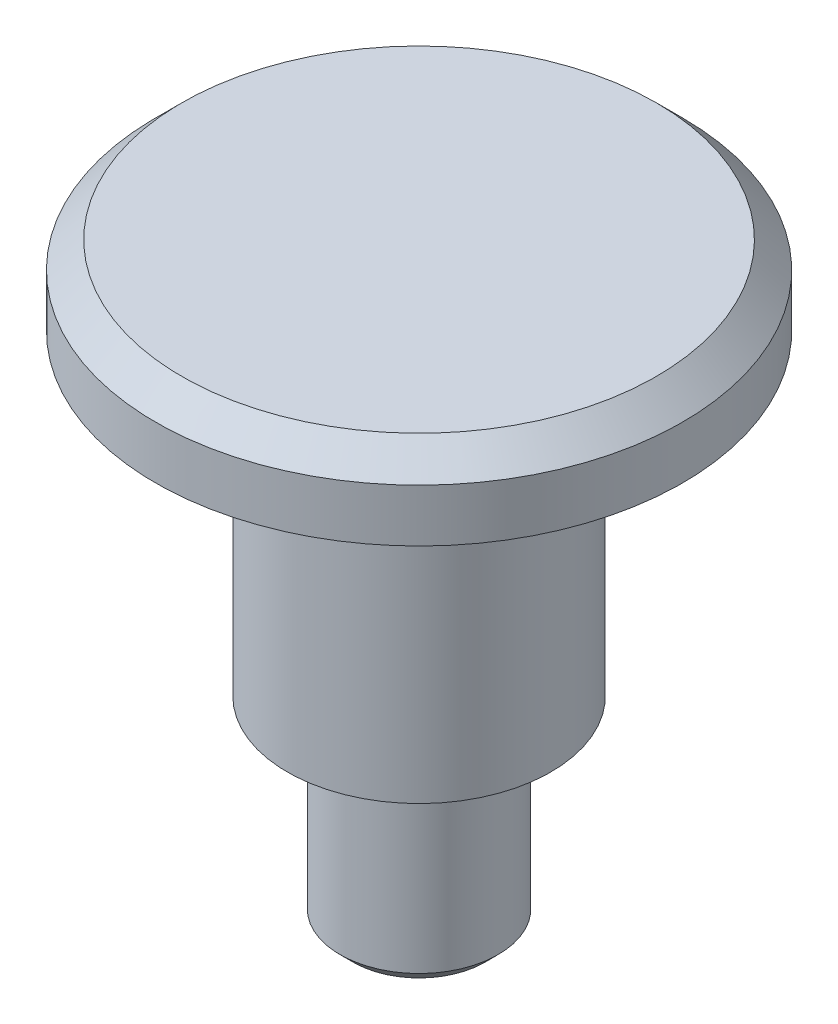
ISO-10303-21;
HEADER;
FILE_DESCRIPTION(('STEP AP214'),'2;1');
FILE_NAME('part.step','',(''),(''),'','','');
FILE_SCHEMA(('AUTOMOTIVE_DESIGN { 1 0 10303 214 1 1 1 1 }'));
ENDSEC;
DATA;
#1=APPLICATION_CONTEXT('core data for automotive mechanical design processes');
#2=APPLICATION_PROTOCOL_DEFINITION('international standard','automotive_design',2000,#1);
#3=PRODUCT_CONTEXT('',#1,'mechanical');
#4=PRODUCT('Part','Part','',(#3));
#5=PRODUCT_RELATED_PRODUCT_CATEGORY('part','',(#4));
#6=PRODUCT_DEFINITION_FORMATION('','',#4);
#7=PRODUCT_DEFINITION_CONTEXT('part definition',#1,'design');
#8=PRODUCT_DEFINITION('design','',#6,#7);
#9=PRODUCT_DEFINITION_SHAPE('','',#8);
#10=(LENGTH_UNIT() NAMED_UNIT(*) SI_UNIT(.MILLI.,.METRE.));
#11=(NAMED_UNIT(*) PLANE_ANGLE_UNIT() SI_UNIT($,.RADIAN.));
#12=(NAMED_UNIT(*) SI_UNIT($,.STERADIAN.) SOLID_ANGLE_UNIT());
#13=UNCERTAINTY_MEASURE_WITH_UNIT(LENGTH_MEASURE(1.E-05),#10,'distance_accuracy_value','');
#14=(GEOMETRIC_REPRESENTATION_CONTEXT(3) GLOBAL_UNCERTAINTY_ASSIGNED_CONTEXT((#13)) GLOBAL_UNIT_ASSIGNED_CONTEXT((#10,
#11,#12)) REPRESENTATION_CONTEXT('',''));
#15=CARTESIAN_POINT('',(0.,0.,0.));
#16=DIRECTION('',(0.,0.,1.));
#17=DIRECTION('',(1.,0.,0.));
#18=AXIS2_PLACEMENT_3D('',#15,#16,#17);
#19=CARTESIAN_POINT('',(0.,0.,1.11022302462516E-13));
#20=DIRECTION('',(0.,-1.,0.));
#21=DIRECTION('',(0.,0.,-1.));
#22=AXIS2_PLACEMENT_3D('',#19,#20,#21);
#23=PLANE('',#22);
#24=CARTESIAN_POINT('',(0.,0.,1.11022302462516E-13));
#25=DIRECTION('',(0.,-1.,0.));
#26=DIRECTION('',(0.,0.,-1.));
#27=AXIS2_PLACEMENT_3D('',#24,#25,#26);
#28=CIRCLE('',#27,2.5);
#29=CARTESIAN_POINT('',(0.,0.,-2.4999999999999));
#30=VERTEX_POINT('',#29);
#31=EDGE_CURVE('E10',#30,#30,#28,.T.);
#32=ORIENTED_EDGE('',*,*,#31,.T.);
#33=EDGE_LOOP('',(#32));
#34=FACE_BOUND('',#33,.T.);
#35=ADVANCED_FACE('F33',(#34),#23,.T.);
#36=CARTESIAN_POINT('',(0.,0.,1.11022302462516E-13));
#37=DIRECTION('',(0.,1.,0.));
#38=DIRECTION('',(0.,0.,1.));
#39=AXIS2_PLACEMENT_3D('',#36,#37,#38);
#40=CONICAL_SURFACE('',#39,2.5,0.785398163397448);
#41=CARTESIAN_POINT('',(0.,0.5,0.));
#42=DIRECTION('',(0.,-1.,0.));
#43=DIRECTION('',(0.,0.,-1.));
#44=AXIS2_PLACEMENT_3D('',#41,#42,#43);
#45=CIRCLE('',#44,3.);
#46=CARTESIAN_POINT('',(0.,0.5,-3.00000000000002));
#47=VERTEX_POINT('',#46);
#48=EDGE_CURVE('E39',#47,#47,#45,.T.);
#49=ORIENTED_EDGE('',*,*,#48,.T.);
#50=EDGE_LOOP('',(#49));
#51=FACE_BOUND('',#50,.T.);
#52=ORIENTED_EDGE('',*,*,#31,.F.);
#53=EDGE_LOOP('',(#52));
#54=FACE_BOUND('',#53,.T.);
#55=ADVANCED_FACE('F83',(#51,#54),#40,.T.);
#56=CARTESIAN_POINT('',(0.,0.,1.11022302462516E-13));
#57=DIRECTION('',(0.,-1.,0.));
#58=DIRECTION('',(0.,0.,-1.));
#59=AXIS2_PLACEMENT_3D('',#56,#57,#58);
#60=CYLINDRICAL_SURFACE('',#59,3.);
#61=CARTESIAN_POINT('',(0.,7.50000000000001,-1.11022302462516E-13));
#62=DIRECTION('',(0.,-1.,0.));
#63=DIRECTION('',(0.,0.,-1.));
#64=AXIS2_PLACEMENT_3D('',#61,#62,#63);
#65=CIRCLE('',#64,3.);
#66=CARTESIAN_POINT('',(0.,7.50000000000001,-3.00000000000013));
#67=VERTEX_POINT('',#66);
#68=EDGE_CURVE('E43',#67,#67,#65,.T.);
#69=ORIENTED_EDGE('',*,*,#68,.T.);
#70=EDGE_LOOP('',(#69));
#71=FACE_BOUND('',#70,.T.);
#72=ORIENTED_EDGE('',*,*,#48,.F.);
#73=EDGE_LOOP('',(#72));
#74=FACE_BOUND('',#73,.T.);
#75=ADVANCED_FACE('F87',(#71,#74),#60,.T.);
#76=CARTESIAN_POINT('',(0.,7.50000000000001,-1.11022302462516E-13));
#77=DIRECTION('',(0.,-1.,0.));
#78=DIRECTION('',(0.,0.,-1.));
#79=AXIS2_PLACEMENT_3D('',#76,#77,#78);
#80=TOROIDAL_SURFACE('',#79,3.3,0.3);
#81=CARTESIAN_POINT('',(0.,7.50000000000001,-1.11022302462516E-13));
#82=DIRECTION('',(0.,-1.,0.));
#83=DIRECTION('',(0.,0.,-1.));
#84=AXIS2_PLACEMENT_3D('',#81,#82,#83);
#85=CIRCLE('',#84,3.6);
#86=CARTESIAN_POINT('',(0.,7.50000000000001,-3.60000000000013));
#87=VERTEX_POINT('',#86);
#88=EDGE_CURVE('E47',#87,#87,#85,.T.);
#89=ORIENTED_EDGE('',*,*,#88,.T.);
#90=EDGE_LOOP('',(#89));
#91=FACE_BOUND('',#90,.T.);
#92=ORIENTED_EDGE('',*,*,#68,.F.);
#93=EDGE_LOOP('',(#92));
#94=FACE_BOUND('',#93,.T.);
#95=ADVANCED_FACE('F91',(#91,#94),#80,.F.);
#96=CARTESIAN_POINT('',(4.99999999999989,7.50000000000051,0.));
#97=DIRECTION('',(0.,-1.,0.));
#98=DIRECTION('',(0.,0.,-1.));
#99=AXIS2_PLACEMENT_3D('',#96,#97,#98);
#100=PLANE('',#99);
#101=CARTESIAN_POINT('',(0.,7.50000000000001,-1.11022302462516E-13));
#102=DIRECTION('',(0.,-1.,0.));
#103=DIRECTION('',(0.,0.,-1.));
#104=AXIS2_PLACEMENT_3D('',#101,#102,#103);
#105=CIRCLE('',#104,5.);
#106=CARTESIAN_POINT('',(0.,7.50000000000001,-5.00000000000014));
#107=VERTEX_POINT('',#106);
#108=EDGE_CURVE('E52',#107,#107,#105,.T.);
#109=ORIENTED_EDGE('',*,*,#108,.T.);
#110=EDGE_LOOP('',(#109));
#111=FACE_BOUND('',#110,.T.);
#112=ORIENTED_EDGE('',*,*,#88,.F.);
#113=EDGE_LOOP('',(#112));
#114=FACE_BOUND('',#113,.T.);
#115=ADVANCED_FACE('F98',(#111,#114),#100,.T.);
#116=CARTESIAN_POINT('',(0.,0.,1.11022302462516E-13));
#117=DIRECTION('',(0.,-1.,0.));
#118=DIRECTION('',(0.,0.,-1.));
#119=AXIS2_PLACEMENT_3D('',#116,#117,#118);
#120=CYLINDRICAL_SURFACE('',#119,5.);
#121=CARTESIAN_POINT('',(0.,19.5,5.55111512312578E-13));
#122=DIRECTION('',(0.,-1.,0.));
#123=DIRECTION('',(0.,0.,-1.));
#124=AXIS2_PLACEMENT_3D('',#121,#122,#123);
#125=CIRCLE('',#124,5.);
#126=CARTESIAN_POINT('',(0.,19.5,-4.99999999999947));
#127=VERTEX_POINT('',#126);
#128=EDGE_CURVE('E55',#127,#127,#125,.T.);
#129=ORIENTED_EDGE('',*,*,#128,.T.);
#130=EDGE_LOOP('',(#129));
#131=FACE_BOUND('',#130,.T.);
#132=ORIENTED_EDGE('',*,*,#108,.F.);
#133=EDGE_LOOP('',(#132));
#134=FACE_BOUND('',#133,.T.);
#135=ADVANCED_FACE('F102',(#131,#134),#120,.T.);
#136=CARTESIAN_POINT('',(0.,19.5,5.55111512312578E-13));
#137=DIRECTION('',(0.,-1.,0.));
#138=DIRECTION('',(0.,0.,-1.));
#139=AXIS2_PLACEMENT_3D('',#136,#137,#138);
#140=TOROIDAL_SURFACE('',#139,5.3,0.3);
#141=CARTESIAN_POINT('',(0.,19.5,5.55111512312578E-13));
#142=DIRECTION('',(0.,-1.,0.));
#143=DIRECTION('',(0.,0.,-1.));
#144=AXIS2_PLACEMENT_3D('',#141,#142,#143);
#145=CIRCLE('',#144,5.6);
#146=CARTESIAN_POINT('',(0.,19.5,-5.59999999999947));
#147=VERTEX_POINT('',#146);
#148=EDGE_CURVE('E58',#147,#147,#145,.T.);
#149=ORIENTED_EDGE('',*,*,#148,.T.);
#150=EDGE_LOOP('',(#149));
#151=FACE_BOUND('',#150,.T.);
#152=ORIENTED_EDGE('',*,*,#128,.F.);
#153=EDGE_LOOP('',(#152));
#154=FACE_BOUND('',#153,.T.);
#155=ADVANCED_FACE('F106',(#151,#154),#140,.F.);
#156=CARTESIAN_POINT('',(5.59999999999938,19.5000000000001,5.55111512312578E-13));
#157=DIRECTION('',(0.,-1.,0.));
#158=DIRECTION('',(0.,0.,-1.));
#159=AXIS2_PLACEMENT_3D('',#156,#157,#158);
#160=PLANE('',#159);
#161=CARTESIAN_POINT('',(0.,19.5,5.55111512312578E-13));
#162=DIRECTION('',(0.,-1.,0.));
#163=DIRECTION('',(0.,0.,-1.));
#164=AXIS2_PLACEMENT_3D('',#161,#162,#163);
#165=CIRCLE('',#164,10.);
#166=CARTESIAN_POINT('',(0.,19.5,-9.9999999999995));
#167=VERTEX_POINT('',#166);
#168=EDGE_CURVE('E61',#167,#167,#165,.T.);
#169=ORIENTED_EDGE('',*,*,#168,.T.);
#170=EDGE_LOOP('',(#169));
#171=FACE_BOUND('',#170,.T.);
#172=ORIENTED_EDGE('',*,*,#148,.F.);
#173=EDGE_LOOP('',(#172));
#174=FACE_BOUND('',#173,.T.);
#175=ADVANCED_FACE('F110',(#171,#174),#160,.T.);
#176=CARTESIAN_POINT('',(0.,0.,1.11022302462516E-13));
#177=DIRECTION('',(0.,-1.,0.));
#178=DIRECTION('',(0.,0.,-1.));
#179=AXIS2_PLACEMENT_3D('',#176,#177,#178);
#180=CYLINDRICAL_SURFACE('',#179,10.);
#181=CARTESIAN_POINT('',(0.,21.5000000000006,0.));
#182=DIRECTION('',(0.,-1.,0.));
#183=DIRECTION('',(0.,0.,-1.));
#184=AXIS2_PLACEMENT_3D('',#181,#182,#183);
#185=CIRCLE('',#184,10.);
#186=CARTESIAN_POINT('',(0.,21.5000000000006,-10.0000000000001));
#187=VERTEX_POINT('',#186);
#188=EDGE_CURVE('E64',#187,#187,#185,.T.);
#189=ORIENTED_EDGE('',*,*,#188,.T.);
#190=EDGE_LOOP('',(#189));
#191=FACE_BOUND('',#190,.T.);
#192=ORIENTED_EDGE('',*,*,#168,.F.);
#193=EDGE_LOOP('',(#192));
#194=FACE_BOUND('',#193,.T.);
#195=ADVANCED_FACE('F80',(#191,#194),#180,.T.);
#196=CARTESIAN_POINT('',(0.,21.5000000000006,0.));
#197=DIRECTION('',(0.,-1.,0.));
#198=DIRECTION('',(0.,0.,-1.));
#199=AXIS2_PLACEMENT_3D('',#196,#197,#198);
#200=CONICAL_SURFACE('',#199,10.,0.785398163397447);
#201=CARTESIAN_POINT('',(0.,22.5000000000005,0.));
#202=DIRECTION('',(0.,-1.,0.));
#203=DIRECTION('',(0.,0.,-1.));
#204=AXIS2_PLACEMENT_3D('',#201,#202,#203);
#205=CIRCLE('',#204,9.00000000000001);
#206=CARTESIAN_POINT('',(0.,22.5000000000005,-9.00000000000005));
#207=VERTEX_POINT('',#206);
#208=EDGE_CURVE('E67',#207,#207,#205,.T.);
#209=ORIENTED_EDGE('',*,*,#208,.T.);
#210=EDGE_LOOP('',(#209));
#211=FACE_BOUND('',#210,.T.);
#212=ORIENTED_EDGE('',*,*,#188,.F.);
#213=EDGE_LOOP('',(#212));
#214=FACE_BOUND('',#213,.T.);
#215=ADVANCED_FACE('F71',(#211,#214),#200,.T.);
#216=CARTESIAN_POINT('',(8.99999999999945,22.5000000000005,-4.44089209850063E-13));
#217=DIRECTION('',(0.,1.,0.));
#218=DIRECTION('',(0.,0.,1.));
#219=AXIS2_PLACEMENT_3D('',#216,#217,#218);
#220=PLANE('',#219);
#221=ORIENTED_EDGE('',*,*,#208,.F.);
#222=EDGE_LOOP('',(#221));
#223=FACE_BOUND('',#222,.T.);
#224=ADVANCED_FACE('F74',(#223),#220,.T.);
#225=CLOSED_SHELL('',(#35,#55,#75,#95,#115,#135,#155,#175,#195,#215,#224));
#226=MANIFOLD_SOLID_BREP('B2',#225);
#227=ADVANCED_BREP_SHAPE_REPRESENTATION('',(#18,#226),#14);
#228=SHAPE_DEFINITION_REPRESENTATION(#9,#227);
ENDSEC;
END-ISO-10303-21;
